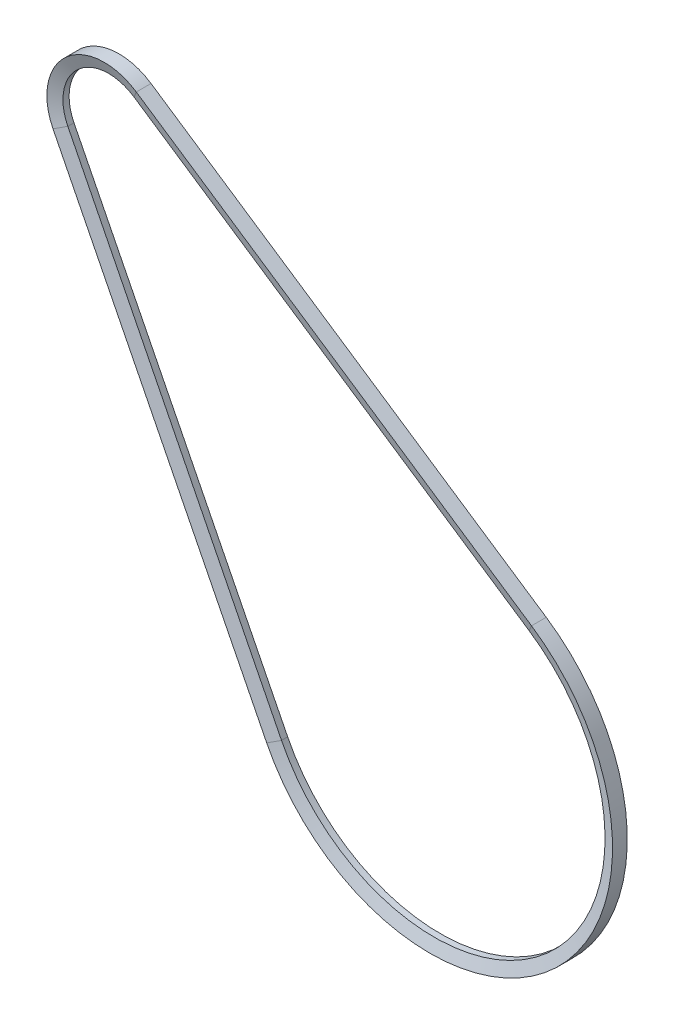
ISO-10303-21;
HEADER;
FILE_DESCRIPTION(('STEP AP214'),'2;1');
FILE_NAME('part.step','',(''),(''),'','','');
FILE_SCHEMA(('AUTOMOTIVE_DESIGN { 1 0 10303 214 1 1 1 1 }'));
ENDSEC;
DATA;
#1=APPLICATION_CONTEXT('core data for automotive mechanical design processes');
#2=APPLICATION_PROTOCOL_DEFINITION('international standard','automotive_design',2000,#1);
#3=PRODUCT_CONTEXT('',#1,'mechanical');
#4=PRODUCT('Part','Part','',(#3));
#5=PRODUCT_RELATED_PRODUCT_CATEGORY('part','',(#4));
#6=PRODUCT_DEFINITION_FORMATION('','',#4);
#7=PRODUCT_DEFINITION_CONTEXT('part definition',#1,'design');
#8=PRODUCT_DEFINITION('design','',#6,#7);
#9=PRODUCT_DEFINITION_SHAPE('','',#8);
#10=(LENGTH_UNIT() NAMED_UNIT(*) SI_UNIT(.MILLI.,.METRE.));
#11=(NAMED_UNIT(*) PLANE_ANGLE_UNIT() SI_UNIT($,.RADIAN.));
#12=(NAMED_UNIT(*) SI_UNIT($,.STERADIAN.) SOLID_ANGLE_UNIT());
#13=UNCERTAINTY_MEASURE_WITH_UNIT(LENGTH_MEASURE(1.E-05),#10,'distance_accuracy_value','');
#14=(GEOMETRIC_REPRESENTATION_CONTEXT(3) GLOBAL_UNCERTAINTY_ASSIGNED_CONTEXT((#13)) GLOBAL_UNIT_ASSIGNED_CONTEXT((#10,
#11,#12)) REPRESENTATION_CONTEXT('',''));
#15=CARTESIAN_POINT('',(0.,0.,0.));
#16=DIRECTION('',(0.,0.,1.));
#17=DIRECTION('',(1.,0.,0.));
#18=AXIS2_PLACEMENT_3D('',#15,#16,#17);
#19=CARTESIAN_POINT('',(285.546435518184,-153.916611068634,2.08823812587041));
#20=DIRECTION('',(0.190311906268058,0.284181556004479,-0.939692620785909));
#21=DIRECTION('',(0.,0.957186469706768,0.289472040463833));
#22=AXIS2_PLACEMENT_3D('',#19,#20,#21);
#23=PLANE('',#22);
#24=DIRECTION('',(-0.522877665124887,-0.780782408147774,-0.342020143325666));
#25=VECTOR('',#24,1.);
#26=CARTESIAN_POINT('',(285.546435518184,-153.916611068634,2.08823812587041));
#27=LINE('',#26,#25);
#28=CARTESIAN_POINT('',(289.997913829784,-147.269480797505,5.));
#29=VERTEX_POINT('',#28);
#30=CARTESIAN_POINT('',(285.546435518184,-153.916611068634,2.08823812587041));
#31=VERTEX_POINT('',#30);
#32=EDGE_CURVE('E156',#29,#31,#27,.T.);
#33=ORIENTED_EDGE('',*,*,#32,.F.);
#34=DIRECTION('',(-0.830891283891097,0.556434788949977,0.));
#35=VECTOR('',#34,1.);
#36=CARTESIAN_POINT('',(289.997913829784,-147.269480797505,5.));
#37=LINE('',#36,#35);
#38=CARTESIAN_POINT('',(21.7009567690254,32.4047600717624,5.));
#39=VERTEX_POINT('',#38);
#40=EDGE_CURVE('E155',#29,#39,#37,.T.);
#41=ORIENTED_EDGE('',*,*,#40,.T.);
#42=DIRECTION('',(-0.522877665124887,-0.780782408147774,-0.342020143325666));
#43=VECTOR('',#42,1.);
#44=CARTESIAN_POINT('',(17.2494784574253,25.7576298006338,2.08823812587041));
#45=LINE('',#44,#43);
#46=CARTESIAN_POINT('',(17.2494784574253,25.7576298006338,2.08823812587041));
#47=VERTEX_POINT('',#46);
#48=EDGE_CURVE('E132',#39,#47,#45,.T.);
#49=ORIENTED_EDGE('',*,*,#48,.T.);
#50=DIRECTION('',(-0.830891283891097,0.556434788949977,0.));
#51=VECTOR('',#50,1.);
#52=CARTESIAN_POINT('',(285.546435518184,-153.916611068634,2.08823812587041));
#53=LINE('',#52,#51);
#54=EDGE_CURVE('E161',#31,#47,#53,.T.);
#55=ORIENTED_EDGE('',*,*,#54,.F.);
#56=EDGE_LOOP('',(#33,#41,#49,#55));
#57=FACE_BOUND('',#56,.T.);
#58=ADVANCED_FACE('F37',(#57),#23,.F.);
#59=CARTESIAN_POINT('',(-2.39808173319034E-11,9.76996261670138E-12,5.));
#60=DIRECTION('',(0.,0.,1.));
#61=DIRECTION('',(1.,0.,0.));
#62=AXIS2_PLACEMENT_3D('',#59,#60,#61);
#63=CONICAL_SURFACE('',#62,39.,1.22173047639603);
#64=CARTESIAN_POINT('',(-2.39808173319034E-11,9.76996261670138E-12,2.08823812587041));
#65=DIRECTION('',(0.,0.,1.));
#66=DIRECTION('',(0.556434788949977,0.830891283891096,0.));
#67=AXIS2_PLACEMENT_3D('',#64,#65,#66);
#68=CIRCLE('',#67,31.);
#69=CARTESIAN_POINT('',(-27.6957840770318,-13.9263614903352,2.08823812587041));
#70=VERTEX_POINT('',#69);
#71=EDGE_CURVE('E122',#47,#70,#68,.T.);
#72=ORIENTED_EDGE('',*,*,#71,.F.);
#73=ORIENTED_EDGE('',*,*,#48,.F.);
#74=CARTESIAN_POINT('',(-2.39808173319034E-11,9.76996261670138E-12,5.));
#75=DIRECTION('',(0.,0.,1.));
#76=DIRECTION('',(0.556434788949983,0.830891283891092,0.));
#77=AXIS2_PLACEMENT_3D('',#74,#75,#76);
#78=CIRCLE('',#77,39.);
#79=CARTESIAN_POINT('',(-34.8430831936843,-17.5202612297684,5.));
#80=VERTEX_POINT('',#79);
#81=EDGE_CURVE('E135',#39,#80,#78,.T.);
#82=ORIENTED_EDGE('',*,*,#81,.T.);
#83=DIRECTION('',(0.8395330298085,0.422145133123729,-0.342020143325666));
#84=VECTOR('',#83,1.);
#85=CARTESIAN_POINT('',(-27.6957840770119,-13.9263614903252,2.08823812587041));
#86=LINE('',#85,#84);
#87=EDGE_CURVE('E152',#80,#70,#86,.T.);
#88=ORIENTED_EDGE('',*,*,#87,.T.);
#89=EDGE_LOOP('',(#72,#73,#82,#88));
#90=FACE_BOUND('',#89,.T.);
#91=ADVANCED_FACE('F134',(#90),#63,.F.);
#92=CARTESIAN_POINT('',(-2.39808173319034E-11,9.76996261670138E-12,0.));
#93=DIRECTION('',(0.,0.,1.));
#94=DIRECTION('',(1.,0.,0.));
#95=AXIS2_PLACEMENT_3D('',#92,#93,#94);
#96=CYLINDRICAL_SURFACE('',#95,31.);
#97=CARTESIAN_POINT('',(-2.39808173319034E-11,9.76996261670138E-12,-2.08823812587041));
#98=DIRECTION('',(0.,0.,1.));
#99=DIRECTION('',(0.556434788949977,0.830891283891096,0.));
#100=AXIS2_PLACEMENT_3D('',#97,#98,#99);
#101=CIRCLE('',#100,31.);
#102=CARTESIAN_POINT('',(17.2494784574253,25.7576298006338,-2.08823812587041));
#103=VERTEX_POINT('',#102);
#104=CARTESIAN_POINT('',(-27.6957840770318,-13.9263614903352,-2.08823812587041));
#105=VERTEX_POINT('',#104);
#106=EDGE_CURVE('E116',#103,#105,#101,.T.);
#107=ORIENTED_EDGE('',*,*,#106,.F.);
#108=DIRECTION('',(0.,0.,-1.));
#109=VECTOR('',#108,1.);
#110=CARTESIAN_POINT('',(17.2494784574253,25.7576298006338,-2.08823812587041));
#111=LINE('',#110,#109);
#112=EDGE_CURVE('E141',#47,#103,#111,.T.);
#113=ORIENTED_EDGE('',*,*,#112,.F.);
#114=ORIENTED_EDGE('',*,*,#71,.T.);
#115=DIRECTION('',(0.,0.,-1.));
#116=VECTOR('',#115,1.);
#117=CARTESIAN_POINT('',(-27.6957840770119,-13.9263614903252,-2.08823812587041));
#118=LINE('',#117,#116);
#119=EDGE_CURVE('E238',#70,#105,#118,.T.);
#120=ORIENTED_EDGE('',*,*,#119,.T.);
#121=EDGE_LOOP('',(#107,#113,#114,#120));
#122=FACE_BOUND('',#121,.T.);
#123=ADVANCED_FACE('F260',(#122),#96,.F.);
#124=CARTESIAN_POINT('',(-2.39808173319034E-11,9.76996261670138E-12,-2.08823812587041));
#125=DIRECTION('',(0.,0.,-1.));
#126=DIRECTION('',(-1.,0.,0.));
#127=AXIS2_PLACEMENT_3D('',#124,#125,#126);
#128=CONICAL_SURFACE('',#127,31.,1.22173047639603);
#129=CARTESIAN_POINT('',(-2.39808173319034E-11,9.76996261670138E-12,-5.));
#130=DIRECTION('',(0.,0.,1.));
#131=DIRECTION('',(0.556434788949983,0.830891283891092,0.));
#132=AXIS2_PLACEMENT_3D('',#129,#130,#131);
#133=CIRCLE('',#132,39.);
#134=CARTESIAN_POINT('',(21.7009567690254,32.4047600717624,-5.));
#135=VERTEX_POINT('',#134);
#136=CARTESIAN_POINT('',(-34.8430831936843,-17.5202612297684,-5.));
#137=VERTEX_POINT('',#136);
#138=EDGE_CURVE('E176',#135,#137,#133,.T.);
#139=ORIENTED_EDGE('',*,*,#138,.F.);
#140=DIRECTION('',(0.522877665124887,0.780782408147774,-0.342020143325666));
#141=VECTOR('',#140,1.);
#142=CARTESIAN_POINT('',(21.7009567690254,32.4047600717624,-5.));
#143=LINE('',#142,#141);
#144=EDGE_CURVE('E165',#103,#135,#143,.T.);
#145=ORIENTED_EDGE('',*,*,#144,.F.);
#146=ORIENTED_EDGE('',*,*,#106,.T.);
#147=DIRECTION('',(-0.8395330298085,-0.422145133123729,-0.342020143325666));
#148=VECTOR('',#147,1.);
#149=CARTESIAN_POINT('',(-34.8430831936644,-17.5202612297584,-5.));
#150=LINE('',#149,#148);
#151=EDGE_CURVE('E214',#105,#137,#150,.T.);
#152=ORIENTED_EDGE('',*,*,#151,.T.);
#153=EDGE_LOOP('',(#139,#145,#146,#152));
#154=FACE_BOUND('',#153,.T.);
#155=ADVANCED_FACE('F219',(#154),#128,.F.);
#156=CARTESIAN_POINT('',(-2.39808173319034E-11,9.76996261670138E-12,0.));
#157=DIRECTION('',(0.,0.,1.));
#158=DIRECTION('',(1.,0.,0.));
#159=AXIS2_PLACEMENT_3D('',#156,#157,#158);
#160=CYLINDRICAL_SURFACE('',#159,39.);
#161=DIRECTION('',(0.,0.,1.));
#162=VECTOR('',#161,1.);
#163=CARTESIAN_POINT('',(-34.8430831936644,-17.5202612297584,5.));
#164=LINE('',#163,#162);
#165=EDGE_CURVE('E149',#137,#80,#164,.T.);
#166=ORIENTED_EDGE('',*,*,#165,.T.);
#167=ORIENTED_EDGE('',*,*,#81,.F.);
#168=DIRECTION('',(0.,0.,1.));
#169=VECTOR('',#168,1.);
#170=CARTESIAN_POINT('',(21.7009567690254,32.4047600717624,5.));
#171=LINE('',#170,#169);
#172=EDGE_CURVE('E148',#135,#39,#171,.T.);
#173=ORIENTED_EDGE('',*,*,#172,.F.);
#174=ORIENTED_EDGE('',*,*,#138,.T.);
#175=EDGE_LOOP('',(#166,#167,#173,#174));
#176=FACE_BOUND('',#175,.T.);
#177=ADVANCED_FACE('F146',(#176),#160,.T.);
#178=CARTESIAN_POINT('',(-27.6957840770119,-13.9263614903252,2.08823812587041));
#179=DIRECTION('',(-0.305565033533606,-0.15364826299739,-0.939692620785909));
#180=DIRECTION('',(-0.950984992212275,0.,0.309237036247308));
#181=AXIS2_PLACEMENT_3D('',#178,#179,#180);
#182=PLANE('',#181);
#183=DIRECTION('',(0.449237467429189,-0.893412389581546,0.));
#184=VECTOR('',#183,1.);
#185=CARTESIAN_POINT('',(-27.6957840770119,-13.9263614903252,2.08823812587041));
#186=LINE('',#185,#184);
#187=CARTESIAN_POINT('',(117.364162808547,-302.411546221777,2.08823812587041));
#188=VERTEX_POINT('',#187);
#189=EDGE_CURVE('E103',#70,#188,#186,.T.);
#190=ORIENTED_EDGE('',*,*,#189,.F.);
#191=ORIENTED_EDGE('',*,*,#87,.F.);
#192=DIRECTION('',(0.449237467429189,-0.893412389581546,0.));
#193=VECTOR('',#192,1.);
#194=CARTESIAN_POINT('',(-34.8430831936644,-17.5202612297584,5.));
#195=LINE('',#194,#193);
#196=CARTESIAN_POINT('',(110.216863691894,-306.00544596121,5.));
#197=VERTEX_POINT('',#196);
#198=EDGE_CURVE('E175',#80,#197,#195,.T.);
#199=ORIENTED_EDGE('',*,*,#198,.T.);
#200=DIRECTION('',(0.8395330298085,0.422145133123729,-0.342020143325666));
#201=VECTOR('',#200,1.);
#202=CARTESIAN_POINT('',(117.364162808527,-302.411546221787,2.08823812587041));
#203=LINE('',#202,#201);
#204=EDGE_CURVE('E225',#197,#188,#203,.T.);
#205=ORIENTED_EDGE('',*,*,#204,.T.);
#206=EDGE_LOOP('',(#190,#191,#199,#205));
#207=FACE_BOUND('',#206,.T.);
#208=ADVANCED_FACE('F259',(#207),#182,.F.);
#209=CARTESIAN_POINT('',(-27.6957840770119,-13.9263614903252,-2.08823812587041));
#210=DIRECTION('',(-0.893412389581546,-0.449237467429189,0.));
#211=DIRECTION('',(0.449237467429189,-0.893412389581546,0.));
#212=AXIS2_PLACEMENT_3D('',#209,#210,#211);
#213=PLANE('',#212);
#214=DIRECTION('',(0.449237467429189,-0.893412389581546,0.));
#215=VECTOR('',#214,1.);
#216=CARTESIAN_POINT('',(-27.6957840770119,-13.9263614903252,-2.08823812587041));
#217=LINE('',#216,#215);
#218=CARTESIAN_POINT('',(117.364162808547,-302.411546221777,-2.08823812587041));
#219=VERTEX_POINT('',#218);
#220=EDGE_CURVE('E96',#105,#219,#217,.T.);
#221=ORIENTED_EDGE('',*,*,#220,.F.);
#222=ORIENTED_EDGE('',*,*,#119,.F.);
#223=ORIENTED_EDGE('',*,*,#189,.T.);
#224=DIRECTION('',(0.,0.,-1.));
#225=VECTOR('',#224,1.);
#226=CARTESIAN_POINT('',(117.364162808527,-302.411546221787,-2.08823812587041));
#227=LINE('',#226,#225);
#228=EDGE_CURVE('E242',#188,#219,#227,.T.);
#229=ORIENTED_EDGE('',*,*,#228,.T.);
#230=EDGE_LOOP('',(#221,#222,#223,#229));
#231=FACE_BOUND('',#230,.T.);
#232=ADVANCED_FACE('F249',(#231),#213,.F.);
#233=CARTESIAN_POINT('',(-34.8430831936644,-17.5202612297584,-5.));
#234=DIRECTION('',(-0.305565033533606,-0.15364826299739,0.939692620785909));
#235=DIRECTION('',(0.950984992212275,0.,0.309237036247308));
#236=AXIS2_PLACEMENT_3D('',#233,#234,#235);
#237=PLANE('',#236);
#238=DIRECTION('',(0.449237467429189,-0.893412389581546,0.));
#239=VECTOR('',#238,1.);
#240=CARTESIAN_POINT('',(-34.8430831936644,-17.5202612297584,-5.));
#241=LINE('',#240,#239);
#242=CARTESIAN_POINT('',(110.216863691894,-306.00544596121,-5.));
#243=VERTEX_POINT('',#242);
#244=EDGE_CURVE('E87',#137,#243,#241,.T.);
#245=ORIENTED_EDGE('',*,*,#244,.F.);
#246=ORIENTED_EDGE('',*,*,#151,.F.);
#247=ORIENTED_EDGE('',*,*,#220,.T.);
#248=DIRECTION('',(-0.8395330298085,-0.422145133123729,-0.342020143325666));
#249=VECTOR('',#248,1.);
#250=CARTESIAN_POINT('',(110.216863691874,-306.00544596122,-5.));
#251=LINE('',#250,#249);
#252=EDGE_CURVE('E188',#219,#243,#251,.T.);
#253=ORIENTED_EDGE('',*,*,#252,.T.);
#254=EDGE_LOOP('',(#245,#246,#247,#253));
#255=FACE_BOUND('',#254,.T.);
#256=ADVANCED_FACE('F220',(#255),#237,.F.);
#257=CARTESIAN_POINT('',(-34.8430831936644,-17.5202612297584,5.));
#258=DIRECTION('',(0.893412389581546,0.449237467429189,0.));
#259=DIRECTION('',(-0.449237467429189,0.893412389581546,0.));
#260=AXIS2_PLACEMENT_3D('',#257,#258,#259);
#261=PLANE('',#260);
#262=DIRECTION('',(0.,0.,1.));
#263=VECTOR('',#262,1.);
#264=CARTESIAN_POINT('',(110.216863691874,-306.00544596122,5.));
#265=LINE('',#264,#263);
#266=EDGE_CURVE('E177',#243,#197,#265,.T.);
#267=ORIENTED_EDGE('',*,*,#266,.T.);
#268=ORIENTED_EDGE('',*,*,#198,.F.);
#269=ORIENTED_EDGE('',*,*,#165,.F.);
#270=ORIENTED_EDGE('',*,*,#244,.T.);
#271=EDGE_LOOP('',(#267,#268,#269,#270));
#272=FACE_BOUND('',#271,.T.);
#273=ADVANCED_FACE('F221',(#272),#261,.F.);
#274=CARTESIAN_POINT('',(220.999999999986,-250.300000000001,5.));
#275=DIRECTION('',(0.,0.,1.));
#276=DIRECTION('',(1.,0.,0.));
#277=AXIS2_PLACEMENT_3D('',#274,#275,#276);
#278=CONICAL_SURFACE('',#277,124.,1.22173047639603);
#279=CARTESIAN_POINT('',(220.999999999986,-250.300000000001,2.08823812587041));
#280=DIRECTION('',(0.,0.,1.));
#281=DIRECTION('',(-0.893412389581546,-0.449237467429189,0.));
#282=AXIS2_PLACEMENT_3D('',#279,#280,#281);
#283=CIRCLE('',#282,116.);
#284=EDGE_CURVE('E185',#188,#31,#283,.T.);
#285=ORIENTED_EDGE('',*,*,#284,.F.);
#286=ORIENTED_EDGE('',*,*,#204,.F.);
#287=CARTESIAN_POINT('',(220.999999999986,-250.300000000001,5.));
#288=DIRECTION('',(0.,0.,1.));
#289=DIRECTION('',(-0.893412389581547,-0.449237467429187,0.));
#290=AXIS2_PLACEMENT_3D('',#287,#288,#289);
#291=CIRCLE('',#290,124.);
#292=EDGE_CURVE('E179',#197,#29,#291,.T.);
#293=ORIENTED_EDGE('',*,*,#292,.T.);
#294=ORIENTED_EDGE('',*,*,#32,.T.);
#295=EDGE_LOOP('',(#285,#286,#293,#294));
#296=FACE_BOUND('',#295,.T.);
#297=ADVANCED_FACE('F258',(#296),#278,.F.);
#298=CARTESIAN_POINT('',(220.999999999986,-250.300000000001,0.));
#299=DIRECTION('',(0.,0.,1.));
#300=DIRECTION('',(1.,0.,0.));
#301=AXIS2_PLACEMENT_3D('',#298,#299,#300);
#302=CYLINDRICAL_SURFACE('',#301,116.);
#303=CARTESIAN_POINT('',(220.999999999986,-250.300000000001,-2.08823812587041));
#304=DIRECTION('',(0.,0.,1.));
#305=DIRECTION('',(-0.893412389581546,-0.449237467429189,0.));
#306=AXIS2_PLACEMENT_3D('',#303,#304,#305);
#307=CIRCLE('',#306,116.);
#308=CARTESIAN_POINT('',(285.546435518184,-153.916611068634,-2.08823812587041));
#309=VERTEX_POINT('',#308);
#310=EDGE_CURVE('E63',#219,#309,#307,.T.);
#311=ORIENTED_EDGE('',*,*,#310,.F.);
#312=ORIENTED_EDGE('',*,*,#228,.F.);
#313=ORIENTED_EDGE('',*,*,#284,.T.);
#314=DIRECTION('',(0.,0.,-1.));
#315=VECTOR('',#314,1.);
#316=CARTESIAN_POINT('',(285.546435518184,-153.916611068634,-2.08823812587041));
#317=LINE('',#316,#315);
#318=EDGE_CURVE('E197',#31,#309,#317,.T.);
#319=ORIENTED_EDGE('',*,*,#318,.T.);
#320=EDGE_LOOP('',(#311,#312,#313,#319));
#321=FACE_BOUND('',#320,.T.);
#322=ADVANCED_FACE('F251',(#321),#302,.F.);
#323=CARTESIAN_POINT('',(220.999999999986,-250.300000000001,-2.08823812587041));
#324=DIRECTION('',(0.,0.,-1.));
#325=DIRECTION('',(-1.,0.,0.));
#326=AXIS2_PLACEMENT_3D('',#323,#324,#325);
#327=CONICAL_SURFACE('',#326,116.,1.22173047639603);
#328=CARTESIAN_POINT('',(220.999999999986,-250.300000000001,-5.));
#329=DIRECTION('',(0.,0.,1.));
#330=DIRECTION('',(-0.893412389581547,-0.449237467429187,0.));
#331=AXIS2_PLACEMENT_3D('',#328,#329,#330);
#332=CIRCLE('',#331,124.);
#333=CARTESIAN_POINT('',(289.997913829784,-147.269480797505,-5.));
#334=VERTEX_POINT('',#333);
#335=EDGE_CURVE('E55',#243,#334,#332,.T.);
#336=ORIENTED_EDGE('',*,*,#335,.F.);
#337=ORIENTED_EDGE('',*,*,#252,.F.);
#338=ORIENTED_EDGE('',*,*,#310,.T.);
#339=DIRECTION('',(0.522877665124887,0.780782408147774,-0.342020143325666));
#340=VECTOR('',#339,1.);
#341=CARTESIAN_POINT('',(289.997913829784,-147.269480797505,-5.));
#342=LINE('',#341,#340);
#343=EDGE_CURVE('E195',#309,#334,#342,.T.);
#344=ORIENTED_EDGE('',*,*,#343,.T.);
#345=EDGE_LOOP('',(#336,#337,#338,#344));
#346=FACE_BOUND('',#345,.T.);
#347=ADVANCED_FACE('F254',(#346),#327,.F.);
#348=CARTESIAN_POINT('',(220.999999999986,-250.300000000001,0.));
#349=DIRECTION('',(0.,0.,1.));
#350=DIRECTION('',(1.,0.,0.));
#351=AXIS2_PLACEMENT_3D('',#348,#349,#350);
#352=CYLINDRICAL_SURFACE('',#351,124.);
#353=DIRECTION('',(0.,0.,1.));
#354=VECTOR('',#353,1.);
#355=CARTESIAN_POINT('',(289.997913829784,-147.269480797505,5.));
#356=LINE('',#355,#354);
#357=EDGE_CURVE('E41',#334,#29,#356,.T.);
#358=ORIENTED_EDGE('',*,*,#357,.T.);
#359=ORIENTED_EDGE('',*,*,#292,.F.);
#360=ORIENTED_EDGE('',*,*,#266,.F.);
#361=ORIENTED_EDGE('',*,*,#335,.T.);
#362=EDGE_LOOP('',(#358,#359,#360,#361));
#363=FACE_BOUND('',#362,.T.);
#364=ADVANCED_FACE('F255',(#363),#352,.T.);
#365=CARTESIAN_POINT('',(285.546435518184,-153.916611068634,-2.08823812587041));
#366=DIRECTION('',(0.556434788949977,0.830891283891097,0.));
#367=DIRECTION('',(-0.830891283891097,0.556434788949977,0.));
#368=AXIS2_PLACEMENT_3D('',#365,#366,#367);
#369=PLANE('',#368);
#370=ORIENTED_EDGE('',*,*,#54,.T.);
#371=ORIENTED_EDGE('',*,*,#112,.T.);
#372=DIRECTION('',(-0.830891283891097,0.556434788949977,0.));
#373=VECTOR('',#372,1.);
#374=CARTESIAN_POINT('',(285.546435518184,-153.916611068634,-2.08823812587041));
#375=LINE('',#374,#373);
#376=EDGE_CURVE('E47',#309,#103,#375,.T.);
#377=ORIENTED_EDGE('',*,*,#376,.F.);
#378=ORIENTED_EDGE('',*,*,#318,.F.);
#379=EDGE_LOOP('',(#370,#371,#377,#378));
#380=FACE_BOUND('',#379,.T.);
#381=ADVANCED_FACE('F263',(#380),#369,.F.);
#382=CARTESIAN_POINT('',(289.997913829784,-147.269480797505,-5.));
#383=DIRECTION('',(0.190311906268058,0.284181556004479,0.939692620785909));
#384=DIRECTION('',(0.,-0.957186469706768,0.289472040463833));
#385=AXIS2_PLACEMENT_3D('',#382,#383,#384);
#386=PLANE('',#385);
#387=ORIENTED_EDGE('',*,*,#376,.T.);
#388=ORIENTED_EDGE('',*,*,#144,.T.);
#389=DIRECTION('',(-0.830891283891097,0.556434788949977,0.));
#390=VECTOR('',#389,1.);
#391=CARTESIAN_POINT('',(289.997913829784,-147.269480797505,-5.));
#392=LINE('',#391,#390);
#393=EDGE_CURVE('E11',#334,#135,#392,.T.);
#394=ORIENTED_EDGE('',*,*,#393,.F.);
#395=ORIENTED_EDGE('',*,*,#343,.F.);
#396=EDGE_LOOP('',(#387,#388,#394,#395));
#397=FACE_BOUND('',#396,.T.);
#398=ADVANCED_FACE('F265',(#397),#386,.F.);
#399=CARTESIAN_POINT('',(289.997913829784,-147.269480797505,5.));
#400=DIRECTION('',(-0.556434788949977,-0.830891283891097,0.));
#401=DIRECTION('',(0.830891283891097,-0.556434788949977,0.));
#402=AXIS2_PLACEMENT_3D('',#399,#400,#401);
#403=PLANE('',#402);
#404=ORIENTED_EDGE('',*,*,#393,.T.);
#405=ORIENTED_EDGE('',*,*,#172,.T.);
#406=ORIENTED_EDGE('',*,*,#40,.F.);
#407=ORIENTED_EDGE('',*,*,#357,.F.);
#408=EDGE_LOOP('',(#404,#405,#406,#407));
#409=FACE_BOUND('',#408,.T.);
#410=ADVANCED_FACE('F39',(#409),#403,.F.);
#411=CLOSED_SHELL('',(#58,#91,#123,#155,#177,#208,#232,#256,#273,#297,#322,#347,#364,#381,#398,#410));
#412=MANIFOLD_SOLID_BREP('B2',#411);
#413=ADVANCED_BREP_SHAPE_REPRESENTATION('',(#18,#412),#14);
#414=SHAPE_DEFINITION_REPRESENTATION(#9,#413);
ENDSEC;
END-ISO-10303-21;
